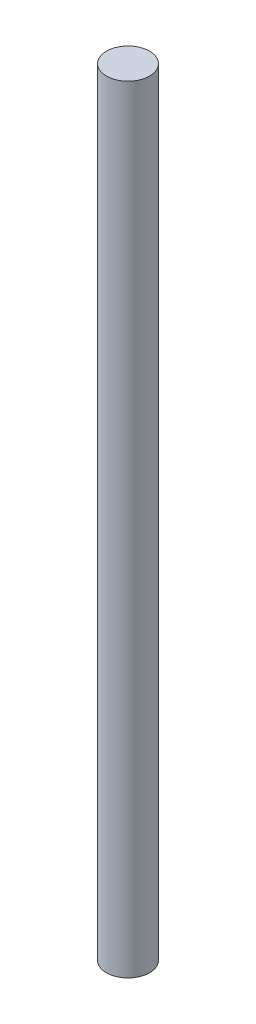
ISO-10303-21;
HEADER;
FILE_DESCRIPTION(('STEP AP214'),'2;1');
FILE_NAME('part.step','',(''),(''),'','','');
FILE_SCHEMA(('AUTOMOTIVE_DESIGN { 1 0 10303 214 1 1 1 1 }'));
ENDSEC;
DATA;
#1=APPLICATION_CONTEXT('core data for automotive mechanical design processes');
#2=APPLICATION_PROTOCOL_DEFINITION('international standard','automotive_design',2000,#1);
#3=PRODUCT_CONTEXT('',#1,'mechanical');
#4=PRODUCT('Part','Part','',(#3));
#5=PRODUCT_RELATED_PRODUCT_CATEGORY('part','',(#4));
#6=PRODUCT_DEFINITION_FORMATION('','',#4);
#7=PRODUCT_DEFINITION_CONTEXT('part definition',#1,'design');
#8=PRODUCT_DEFINITION('design','',#6,#7);
#9=PRODUCT_DEFINITION_SHAPE('','',#8);
#10=(LENGTH_UNIT() NAMED_UNIT(*) SI_UNIT(.MILLI.,.METRE.));
#11=(NAMED_UNIT(*) PLANE_ANGLE_UNIT() SI_UNIT($,.RADIAN.));
#12=(NAMED_UNIT(*) SI_UNIT($,.STERADIAN.) SOLID_ANGLE_UNIT());
#13=UNCERTAINTY_MEASURE_WITH_UNIT(LENGTH_MEASURE(1.E-05),#10,'distance_accuracy_value','');
#14=(GEOMETRIC_REPRESENTATION_CONTEXT(3) GLOBAL_UNCERTAINTY_ASSIGNED_CONTEXT((#13)) GLOBAL_UNIT_ASSIGNED_CONTEXT((#10,
#11,#12)) REPRESENTATION_CONTEXT('',''));
#15=CARTESIAN_POINT('',(0.,0.,0.));
#16=DIRECTION('',(0.,0.,1.));
#17=DIRECTION('',(1.,0.,0.));
#18=AXIS2_PLACEMENT_3D('',#15,#16,#17);
#19=CARTESIAN_POINT('',(0.,180.,0.));
#20=DIRECTION('',(0.,-1.,0.));
#21=DIRECTION('',(0.,0.,-1.));
#22=AXIS2_PLACEMENT_3D('',#19,#20,#21);
#23=CYLINDRICAL_SURFACE('',#22,10.);
#24=CARTESIAN_POINT('',(0.,180.,0.));
#25=DIRECTION('',(0.,1.,0.));
#26=DIRECTION('',(0.,0.,1.));
#27=AXIS2_PLACEMENT_3D('',#24,#25,#26);
#28=CIRCLE('',#27,10.);
#29=CARTESIAN_POINT('',(0.,180.,-10.));
#30=VERTEX_POINT('',#29);
#31=EDGE_CURVE('E10',#30,#30,#28,.T.);
#32=CARTESIAN_POINT('',(0.,-180.,0.));
#33=DIRECTION('',(0.,1.,0.));
#34=DIRECTION('',(0.,0.,1.));
#35=AXIS2_PLACEMENT_3D('',#32,#33,#34);
#36=CIRCLE('',#35,10.);
#37=CARTESIAN_POINT('',(0.,-180.,-10.));
#38=VERTEX_POINT('',#37);
#39=EDGE_CURVE('E37',#38,#38,#36,.T.);
#40=CARTESIAN_POINT('',(0.,180.,-10.));
#41=CARTESIAN_POINT('',(0.,176.25,-10.));
#42=CARTESIAN_POINT('',(0.,172.5,-10.));
#43=CARTESIAN_POINT('',(0.,165.,-10.));
#44=CARTESIAN_POINT('',(0.,161.25,-10.));
#45=CARTESIAN_POINT('',(0.,153.75,-10.));
#46=CARTESIAN_POINT('',(0.,150.,-10.));
#47=CARTESIAN_POINT('',(0.,142.5,-10.));
#48=CARTESIAN_POINT('',(0.,138.75,-10.));
#49=CARTESIAN_POINT('',(0.,131.25,-10.));
#50=CARTESIAN_POINT('',(0.,127.5,-10.));
#51=CARTESIAN_POINT('',(0.,120.,-10.));
#52=CARTESIAN_POINT('',(0.,116.25,-10.));
#53=CARTESIAN_POINT('',(0.,108.75,-10.));
#54=CARTESIAN_POINT('',(0.,105.,-10.));
#55=CARTESIAN_POINT('',(0.,97.5,-10.));
#56=CARTESIAN_POINT('',(0.,93.75,-10.));
#57=CARTESIAN_POINT('',(0.,86.25,-10.));
#58=CARTESIAN_POINT('',(0.,82.5,-10.));
#59=CARTESIAN_POINT('',(0.,75.,-10.));
#60=CARTESIAN_POINT('',(0.,71.25,-10.));
#61=CARTESIAN_POINT('',(0.,63.75,-10.));
#62=CARTESIAN_POINT('',(0.,60.,-10.));
#63=CARTESIAN_POINT('',(0.,52.5,-10.));
#64=CARTESIAN_POINT('',(0.,48.75,-10.));
#65=CARTESIAN_POINT('',(0.,41.25,-10.));
#66=CARTESIAN_POINT('',(0.,37.5,-10.));
#67=CARTESIAN_POINT('',(0.,30.,-10.));
#68=CARTESIAN_POINT('',(0.,26.25,-10.));
#69=CARTESIAN_POINT('',(0.,18.75,-10.));
#70=CARTESIAN_POINT('',(0.,15.,-10.));
#71=CARTESIAN_POINT('',(0.,7.49999999999998,-10.));
#72=CARTESIAN_POINT('',(0.,3.74999999999998,-10.));
#73=CARTESIAN_POINT('',(0.,-3.75000000000003,-10.));
#74=CARTESIAN_POINT('',(0.,-7.50000000000003,-10.));
#75=CARTESIAN_POINT('',(0.,-15.,-10.));
#76=CARTESIAN_POINT('',(0.,-18.75,-10.));
#77=CARTESIAN_POINT('',(0.,-26.25,-10.));
#78=CARTESIAN_POINT('',(0.,-30.,-10.));
#79=CARTESIAN_POINT('',(0.,-37.5,-10.));
#80=CARTESIAN_POINT('',(0.,-41.25,-10.));
#81=CARTESIAN_POINT('',(0.,-48.75,-10.));
#82=CARTESIAN_POINT('',(0.,-52.5,-10.));
#83=CARTESIAN_POINT('',(0.,-60.,-10.));
#84=CARTESIAN_POINT('',(0.,-63.75,-10.));
#85=CARTESIAN_POINT('',(0.,-71.25,-10.));
#86=CARTESIAN_POINT('',(0.,-75.,-10.));
#87=CARTESIAN_POINT('',(0.,-82.5,-10.));
#88=CARTESIAN_POINT('',(0.,-86.25,-10.));
#89=CARTESIAN_POINT('',(0.,-93.75,-10.));
#90=CARTESIAN_POINT('',(0.,-97.5,-10.));
#91=CARTESIAN_POINT('',(0.,-105.,-10.));
#92=CARTESIAN_POINT('',(0.,-108.75,-10.));
#93=CARTESIAN_POINT('',(0.,-116.25,-10.));
#94=CARTESIAN_POINT('',(0.,-120.,-10.));
#95=CARTESIAN_POINT('',(0.,-127.5,-10.));
#96=CARTESIAN_POINT('',(0.,-131.25,-10.));
#97=CARTESIAN_POINT('',(0.,-138.75,-10.));
#98=CARTESIAN_POINT('',(0.,-142.5,-10.));
#99=CARTESIAN_POINT('',(0.,-150.,-10.));
#100=CARTESIAN_POINT('',(0.,-153.75,-10.));
#101=CARTESIAN_POINT('',(0.,-161.25,-10.));
#102=CARTESIAN_POINT('',(0.,-165.,-10.));
#103=CARTESIAN_POINT('',(0.,-172.5,-10.));
#104=CARTESIAN_POINT('',(0.,-176.25,-10.));
#105=CARTESIAN_POINT('',(0.,-180.,-10.));
#106=B_SPLINE_CURVE_WITH_KNOTS('',3,(#40,#41,#42,#43,#44,#45,#46,#47,#48,#49,#50,#51,#52,#53,
#54,#55,#56,#57,#58,#59,#60,#61,#62,#63,#64,#65,#66,#67,#68,#69,#70,#71,#72,#73,#74,#75,#76,#77,
#78,#79,#80,#81,#82,#83,#84,#85,#86,#87,#88,#89,#90,#91,#92,#93,#94,#95,#96,#97,#98,#99,#100,
#101,#102,#103,#104,#105),.UNSPECIFIED.,.F.,.F.,(4,2,2,2,2,2,2,2,2,2,2,2,2,2,2,2,2,2,2,2,2,2,2,
2,2,2,2,2,2,2,2,2,4),(0.,11.25,22.5,33.75,45.,56.25,67.5,78.75,90.,101.25,112.5,123.75,135.,
146.25,157.5,168.75,180.,191.25,202.5,213.75,225.,236.25,247.5,258.75,270.,281.25,292.5,303.75,
315.,326.25,337.5,348.75,360.),.UNSPECIFIED.);
#107=EDGE_CURVE('BSEAM34',#30,#38,#106,.T.);
#108=ORIENTED_EDGE('',*,*,#31,.F.);
#109=ORIENTED_EDGE('',*,*,#39,.T.);
#110=ORIENTED_EDGE('',*,*,#107,.T.);
#111=ORIENTED_EDGE('',*,*,#107,.F.);
#112=EDGE_LOOP('',(#108,#110,#109,#111));
#113=FACE_BOUND('',#112,.T.);
#114=ADVANCED_FACE('F34',(#113),#23,.T.);
#115=CARTESIAN_POINT('',(0.,180.,0.));
#116=DIRECTION('',(0.,1.,0.));
#117=DIRECTION('',(0.,0.,1.));
#118=AXIS2_PLACEMENT_3D('',#115,#116,#117);
#119=PLANE('',#118);
#120=ORIENTED_EDGE('',*,*,#31,.T.);
#121=EDGE_LOOP('',(#120));
#122=FACE_BOUND('',#121,.T.);
#123=ADVANCED_FACE('F49',(#122),#119,.T.);
#124=CARTESIAN_POINT('',(0.,-180.,0.));
#125=DIRECTION('',(0.,1.,0.));
#126=DIRECTION('',(0.,0.,1.));
#127=AXIS2_PLACEMENT_3D('',#124,#125,#126);
#128=PLANE('',#127);
#129=ORIENTED_EDGE('',*,*,#39,.F.);
#130=EDGE_LOOP('',(#129));
#131=FACE_BOUND('',#130,.T.);
#132=ADVANCED_FACE('F47',(#131),#128,.F.);
#133=CLOSED_SHELL('',(#114,#123,#132));
#134=MANIFOLD_SOLID_BREP('B2',#133);
#135=ADVANCED_BREP_SHAPE_REPRESENTATION('',(#18,#134),#14);
#136=SHAPE_DEFINITION_REPRESENTATION(#9,#135);
ENDSEC;
END-ISO-10303-21;
